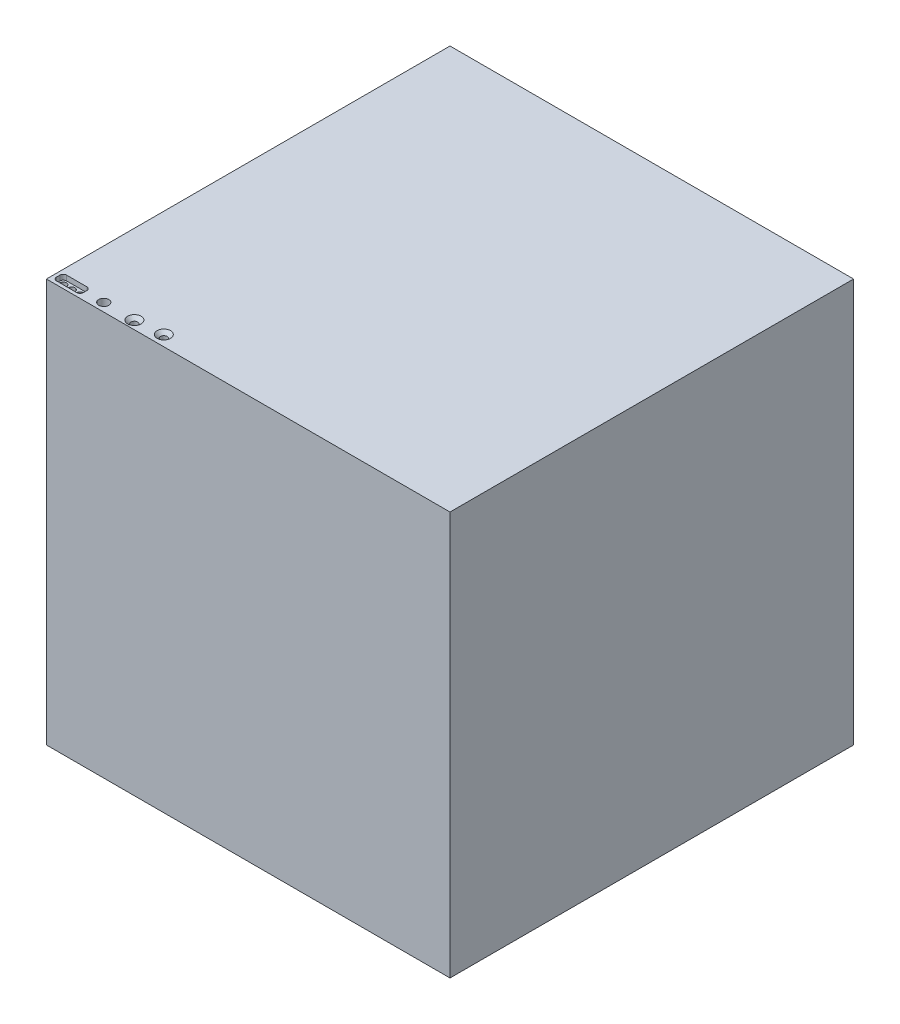
ISO-10303-21;
HEADER;
FILE_DESCRIPTION(('STEP AP214'),'2;1');
FILE_NAME('part.step','',(''),(''),'','','');
FILE_SCHEMA(('AUTOMOTIVE_DESIGN { 1 0 10303 214 1 1 1 1 }'));
ENDSEC;
DATA;
#1=APPLICATION_CONTEXT('core data for automotive mechanical design processes');
#2=APPLICATION_PROTOCOL_DEFINITION('international standard','automotive_design',2000,#1);
#3=PRODUCT_CONTEXT('',#1,'mechanical');
#4=PRODUCT('Part','Part','',(#3));
#5=PRODUCT_RELATED_PRODUCT_CATEGORY('part','',(#4));
#6=PRODUCT_DEFINITION_FORMATION('','',#4);
#7=PRODUCT_DEFINITION_CONTEXT('part definition',#1,'design');
#8=PRODUCT_DEFINITION('design','',#6,#7);
#9=PRODUCT_DEFINITION_SHAPE('','',#8);
#10=(LENGTH_UNIT() NAMED_UNIT(*) SI_UNIT(.MILLI.,.METRE.));
#11=(NAMED_UNIT(*) PLANE_ANGLE_UNIT() SI_UNIT($,.RADIAN.));
#12=(NAMED_UNIT(*) SI_UNIT($,.STERADIAN.) SOLID_ANGLE_UNIT());
#13=UNCERTAINTY_MEASURE_WITH_UNIT(LENGTH_MEASURE(1.E-05),#10,'distance_accuracy_value','');
#14=(GEOMETRIC_REPRESENTATION_CONTEXT(3) GLOBAL_UNCERTAINTY_ASSIGNED_CONTEXT((#13)) GLOBAL_UNIT_ASSIGNED_CONTEXT((#10,
#11,#12)) REPRESENTATION_CONTEXT('',''));
#15=CARTESIAN_POINT('',(0.,0.,0.));
#16=DIRECTION('',(0.,0.,1.));
#17=DIRECTION('',(1.,0.,0.));
#18=AXIS2_PLACEMENT_3D('',#15,#16,#17);
#19=CARTESIAN_POINT('',(0.,1200.,0.));
#20=DIRECTION('',(1.,0.,0.));
#21=DIRECTION('',(0.,0.,-1.));
#22=AXIS2_PLACEMENT_3D('',#19,#20,#21);
#23=PLANE('',#22);
#24=DIRECTION('',(0.,0.,1.));
#25=VECTOR('',#24,1.);
#26=CARTESIAN_POINT('',(0.,0.,0.));
#27=LINE('',#26,#25);
#28=CARTESIAN_POINT('',(0.,0.,-1200.));
#29=VERTEX_POINT('',#28);
#30=CARTESIAN_POINT('',(0.,0.,0.));
#31=VERTEX_POINT('',#30);
#32=EDGE_CURVE('E147',#29,#31,#27,.T.);
#33=ORIENTED_EDGE('',*,*,#32,.T.);
#34=DIRECTION('',(0.,-1.,0.));
#35=VECTOR('',#34,1.);
#36=CARTESIAN_POINT('',(0.,1200.,0.));
#37=LINE('',#36,#35);
#38=CARTESIAN_POINT('',(0.,1200.,0.));
#39=VERTEX_POINT('',#38);
#40=EDGE_CURVE('E128',#39,#31,#37,.T.);
#41=ORIENTED_EDGE('',*,*,#40,.F.);
#42=DIRECTION('',(0.,0.,1.));
#43=VECTOR('',#42,1.);
#44=CARTESIAN_POINT('',(0.,1200.,0.));
#45=LINE('',#44,#43);
#46=CARTESIAN_POINT('',(0.,1200.,-1200.));
#47=VERTEX_POINT('',#46);
#48=EDGE_CURVE('E135',#47,#39,#45,.T.);
#49=ORIENTED_EDGE('',*,*,#48,.F.);
#50=DIRECTION('',(0.,-1.,0.));
#51=VECTOR('',#50,1.);
#52=CARTESIAN_POINT('',(0.,1200.,-1200.));
#53=LINE('',#52,#51);
#54=EDGE_CURVE('E314',#47,#29,#53,.T.);
#55=ORIENTED_EDGE('',*,*,#54,.T.);
#56=EDGE_LOOP('',(#33,#41,#49,#55));
#57=FACE_BOUND('',#56,.T.);
#58=ADVANCED_FACE('F33',(#57),#23,.F.);
#59=CARTESIAN_POINT('',(0.,1200.,0.));
#60=DIRECTION('',(0.,0.,-1.));
#61=DIRECTION('',(-1.,0.,0.));
#62=AXIS2_PLACEMENT_3D('',#59,#60,#61);
#63=PLANE('',#62);
#64=DIRECTION('',(1.,0.,0.));
#65=VECTOR('',#64,1.);
#66=CARTESIAN_POINT('',(0.,0.,0.));
#67=LINE('',#66,#65);
#68=CARTESIAN_POINT('',(1200.,0.,0.));
#69=VERTEX_POINT('',#68);
#70=EDGE_CURVE('E316',#31,#69,#67,.T.);
#71=ORIENTED_EDGE('',*,*,#70,.T.);
#72=DIRECTION('',(0.,-1.,0.));
#73=VECTOR('',#72,1.);
#74=CARTESIAN_POINT('',(1200.,1200.,0.));
#75=LINE('',#74,#73);
#76=CARTESIAN_POINT('',(1200.,1200.,0.));
#77=VERTEX_POINT('',#76);
#78=EDGE_CURVE('E131',#77,#69,#75,.T.);
#79=ORIENTED_EDGE('',*,*,#78,.F.);
#80=DIRECTION('',(1.,0.,0.));
#81=VECTOR('',#80,1.);
#82=CARTESIAN_POINT('',(0.,1200.,0.));
#83=LINE('',#82,#81);
#84=EDGE_CURVE('E124',#39,#77,#83,.T.);
#85=ORIENTED_EDGE('',*,*,#84,.F.);
#86=ORIENTED_EDGE('',*,*,#40,.T.);
#87=EDGE_LOOP('',(#71,#79,#85,#86));
#88=FACE_BOUND('',#87,.T.);
#89=ADVANCED_FACE('F126',(#88),#63,.F.);
#90=CARTESIAN_POINT('',(1200.,1200.,0.));
#91=DIRECTION('',(-1.,0.,0.));
#92=DIRECTION('',(0.,0.,1.));
#93=AXIS2_PLACEMENT_3D('',#90,#91,#92);
#94=PLANE('',#93);
#95=DIRECTION('',(0.,0.,-1.));
#96=VECTOR('',#95,1.);
#97=CARTESIAN_POINT('',(1200.,0.,0.));
#98=LINE('',#97,#96);
#99=CARTESIAN_POINT('',(1200.,0.,-1200.));
#100=VERTEX_POINT('',#99);
#101=EDGE_CURVE('E318',#69,#100,#98,.T.);
#102=ORIENTED_EDGE('',*,*,#101,.T.);
#103=DIRECTION('',(0.,-1.,0.));
#104=VECTOR('',#103,1.);
#105=CARTESIAN_POINT('',(1200.,1200.,-1200.));
#106=LINE('',#105,#104);
#107=CARTESIAN_POINT('',(1200.,1200.,-1200.));
#108=VERTEX_POINT('',#107);
#109=EDGE_CURVE('E152',#108,#100,#106,.T.);
#110=ORIENTED_EDGE('',*,*,#109,.F.);
#111=DIRECTION('',(0.,0.,-1.));
#112=VECTOR('',#111,1.);
#113=CARTESIAN_POINT('',(1200.,1200.,0.));
#114=LINE('',#113,#112);
#115=EDGE_CURVE('E134',#77,#108,#114,.T.);
#116=ORIENTED_EDGE('',*,*,#115,.F.);
#117=ORIENTED_EDGE('',*,*,#78,.T.);
#118=EDGE_LOOP('',(#102,#110,#116,#117));
#119=FACE_BOUND('',#118,.T.);
#120=ADVANCED_FACE('F211',(#119),#94,.F.);
#121=CARTESIAN_POINT('',(0.,1200.,-1200.));
#122=DIRECTION('',(0.,0.,1.));
#123=DIRECTION('',(1.,0.,0.));
#124=AXIS2_PLACEMENT_3D('',#121,#122,#123);
#125=PLANE('',#124);
#126=DIRECTION('',(-1.,0.,0.));
#127=VECTOR('',#126,1.);
#128=CARTESIAN_POINT('',(0.,0.,-1200.));
#129=LINE('',#128,#127);
#130=EDGE_CURVE('E144',#100,#29,#129,.T.);
#131=ORIENTED_EDGE('',*,*,#130,.T.);
#132=ORIENTED_EDGE('',*,*,#54,.F.);
#133=DIRECTION('',(-1.,0.,0.));
#134=VECTOR('',#133,1.);
#135=CARTESIAN_POINT('',(0.,1200.,-1200.));
#136=LINE('',#135,#134);
#137=EDGE_CURVE('E140',#108,#47,#136,.T.);
#138=ORIENTED_EDGE('',*,*,#137,.F.);
#139=ORIENTED_EDGE('',*,*,#109,.T.);
#140=EDGE_LOOP('',(#131,#132,#138,#139));
#141=FACE_BOUND('',#140,.T.);
#142=ADVANCED_FACE('F325',(#141),#125,.F.);
#143=CARTESIAN_POINT('',(0.,1200.,0.));
#144=DIRECTION('',(0.,-1.,0.));
#145=DIRECTION('',(0.,0.,-1.));
#146=AXIS2_PLACEMENT_3D('',#143,#144,#145);
#147=PLANE('',#146);
#148=CARTESIAN_POINT('',(317.39806052974,1200.,-31.6120583291308));
#149=DIRECTION('',(0.,-1.,0.));
#150=DIRECTION('',(0.,0.,-1.));
#151=AXIS2_PLACEMENT_3D('',#148,#149,#150);
#152=CIRCLE('',#151,20.0000000000002);
#153=CARTESIAN_POINT('',(317.39806052974,1200.,-51.6120583291311));
#154=VERTEX_POINT('',#153);
#155=EDGE_CURVE('E11',#154,#154,#152,.T.);
#156=ORIENTED_EDGE('',*,*,#155,.T.);
#157=EDGE_LOOP('',(#156));
#158=FACE_BOUND('',#157,.T.);
#159=CARTESIAN_POINT('',(236.465344036915,1200.,-25.));
#160=DIRECTION('',(0.,-1.,0.));
#161=DIRECTION('',(0.,0.,-1.));
#162=AXIS2_PLACEMENT_3D('',#159,#160,#161);
#163=CIRCLE('',#162,20.);
#164=CARTESIAN_POINT('',(236.465344036915,1200.,-45.));
#165=VERTEX_POINT('',#164);
#166=EDGE_CURVE('E189',#165,#165,#163,.T.);
#167=ORIENTED_EDGE('',*,*,#166,.T.);
#168=EDGE_LOOP('',(#167));
#169=FACE_BOUND('',#168,.T.);
#170=CARTESIAN_POINT('',(145.500055776897,1200.,-25.));
#171=DIRECTION('',(0.,1.,0.));
#172=DIRECTION('',(0.,0.,1.));
#173=AXIS2_PLACEMENT_3D('',#170,#171,#172);
#174=CIRCLE('',#173,15.);
#175=CARTESIAN_POINT('',(145.500055776897,1200.,-9.99999999999998));
#176=VERTEX_POINT('',#175);
#177=EDGE_CURVE('E264',#176,#176,#174,.T.);
#178=ORIENTED_EDGE('',*,*,#177,.F.);
#179=EDGE_LOOP('',(#178));
#180=FACE_BOUND('',#179,.T.);
#181=DIRECTION('',(1.,0.,0.));
#182=VECTOR('',#181,1.);
#183=CARTESIAN_POINT('',(10.,1200.,-10.));
#184=LINE('',#183,#182);
#185=CARTESIAN_POINT('',(20.,1200.,-10.));
#186=VERTEX_POINT('',#185);
#187=CARTESIAN_POINT('',(80.,1200.,-10.));
#188=VERTEX_POINT('',#187);
#189=EDGE_CURVE('E304',#186,#188,#184,.T.);
#190=ORIENTED_EDGE('',*,*,#189,.F.);
#191=CARTESIAN_POINT('',(20.,1200.,-20.));
#192=DIRECTION('',(0.,-1.,0.));
#193=DIRECTION('',(0.,0.,-1.));
#194=AXIS2_PLACEMENT_3D('',#191,#192,#193);
#195=CIRCLE('',#194,10.);
#196=CARTESIAN_POINT('',(10.,1200.,-20.));
#197=VERTEX_POINT('',#196);
#198=EDGE_CURVE('E48',#186,#197,#195,.T.);
#199=ORIENTED_EDGE('',*,*,#198,.T.);
#200=DIRECTION('',(0.,0.,1.));
#201=VECTOR('',#200,1.);
#202=CARTESIAN_POINT('',(10.,1200.,-10.));
#203=LINE('',#202,#201);
#204=CARTESIAN_POINT('',(10.,1200.,-30.));
#205=VERTEX_POINT('',#204);
#206=EDGE_CURVE('E281',#205,#197,#203,.T.);
#207=ORIENTED_EDGE('',*,*,#206,.F.);
#208=CARTESIAN_POINT('',(20.,1200.,-30.));
#209=DIRECTION('',(0.,-1.,0.));
#210=DIRECTION('',(0.,0.,-1.));
#211=AXIS2_PLACEMENT_3D('',#208,#209,#210);
#212=CIRCLE('',#211,10.);
#213=CARTESIAN_POINT('',(20.,1200.,-40.));
#214=VERTEX_POINT('',#213);
#215=EDGE_CURVE('E56',#205,#214,#212,.T.);
#216=ORIENTED_EDGE('',*,*,#215,.T.);
#217=DIRECTION('',(-1.,0.,0.));
#218=VECTOR('',#217,1.);
#219=CARTESIAN_POINT('',(10.,1200.,-40.));
#220=LINE('',#219,#218);
#221=CARTESIAN_POINT('',(80.,1200.,-40.));
#222=VERTEX_POINT('',#221);
#223=EDGE_CURVE('E294',#222,#214,#220,.T.);
#224=ORIENTED_EDGE('',*,*,#223,.F.);
#225=CARTESIAN_POINT('',(80.,1200.,-30.));
#226=DIRECTION('',(0.,-1.,0.));
#227=DIRECTION('',(0.,0.,-1.));
#228=AXIS2_PLACEMENT_3D('',#225,#226,#227);
#229=CIRCLE('',#228,10.);
#230=CARTESIAN_POINT('',(90.,1200.,-30.));
#231=VERTEX_POINT('',#230);
#232=EDGE_CURVE('E182',#222,#231,#229,.T.);
#233=ORIENTED_EDGE('',*,*,#232,.T.);
#234=DIRECTION('',(0.,0.,-1.));
#235=VECTOR('',#234,1.);
#236=CARTESIAN_POINT('',(90.,1200.,-10.));
#237=LINE('',#236,#235);
#238=CARTESIAN_POINT('',(90.,1200.,-20.));
#239=VERTEX_POINT('',#238);
#240=EDGE_CURVE('E307',#239,#231,#237,.T.);
#241=ORIENTED_EDGE('',*,*,#240,.F.);
#242=CARTESIAN_POINT('',(80.,1200.,-20.));
#243=DIRECTION('',(0.,-1.,0.));
#244=DIRECTION('',(0.,0.,-1.));
#245=AXIS2_PLACEMENT_3D('',#242,#243,#244);
#246=CIRCLE('',#245,10.);
#247=EDGE_CURVE('E180',#239,#188,#246,.T.);
#248=ORIENTED_EDGE('',*,*,#247,.T.);
#249=EDGE_LOOP('',(#190,#199,#207,#216,#224,#233,#241,#248));
#250=FACE_BOUND('',#249,.T.);
#251=ORIENTED_EDGE('',*,*,#48,.T.);
#252=ORIENTED_EDGE('',*,*,#84,.T.);
#253=ORIENTED_EDGE('',*,*,#115,.T.);
#254=ORIENTED_EDGE('',*,*,#137,.T.);
#255=EDGE_LOOP('',(#251,#252,#253,#254));
#256=FACE_BOUND('',#255,.T.);
#257=ADVANCED_FACE('F138',(#158,#169,#180,#250,#256),#147,.F.);
#258=CARTESIAN_POINT('',(0.,0.,0.));
#259=DIRECTION('',(0.,-1.,0.));
#260=DIRECTION('',(0.,0.,-1.));
#261=AXIS2_PLACEMENT_3D('',#258,#259,#260);
#262=PLANE('',#261);
#263=CARTESIAN_POINT('',(50.,0.,-25.));
#264=DIRECTION('',(0.,1.,0.));
#265=DIRECTION('',(0.,0.,1.));
#266=AXIS2_PLACEMENT_3D('',#263,#264,#265);
#267=CIRCLE('',#266,10.);
#268=CARTESIAN_POINT('',(50.,0.,-15.));
#269=VERTEX_POINT('',#268);
#270=EDGE_CURVE('E272',#269,#269,#267,.T.);
#271=ORIENTED_EDGE('',*,*,#270,.T.);
#272=EDGE_LOOP('',(#271));
#273=FACE_BOUND('',#272,.T.);
#274=ORIENTED_EDGE('',*,*,#32,.F.);
#275=ORIENTED_EDGE('',*,*,#130,.F.);
#276=ORIENTED_EDGE('',*,*,#101,.F.);
#277=ORIENTED_EDGE('',*,*,#70,.F.);
#278=EDGE_LOOP('',(#274,#275,#276,#277));
#279=FACE_BOUND('',#278,.T.);
#280=ADVANCED_FACE('F329',(#273,#279),#262,.T.);
#281=CARTESIAN_POINT('',(10.,1185.,-10.));
#282=DIRECTION('',(-1.,0.,0.));
#283=DIRECTION('',(0.,0.,1.));
#284=AXIS2_PLACEMENT_3D('',#281,#282,#283);
#285=PLANE('',#284);
#286=DIRECTION('',(0.,0.,1.));
#287=VECTOR('',#286,1.);
#288=CARTESIAN_POINT('',(10.,1185.,-10.));
#289=LINE('',#288,#287);
#290=CARTESIAN_POINT('',(10.,1185.,-30.));
#291=VERTEX_POINT('',#290);
#292=CARTESIAN_POINT('',(10.,1185.,-20.));
#293=VERTEX_POINT('',#292);
#294=EDGE_CURVE('E290',#291,#293,#289,.T.);
#295=ORIENTED_EDGE('',*,*,#294,.F.);
#296=DIRECTION('',(0.,1.,0.));
#297=VECTOR('',#296,1.);
#298=CARTESIAN_POINT('',(10.,1200.,-30.));
#299=LINE('',#298,#297);
#300=EDGE_CURVE('E178',#291,#205,#299,.T.);
#301=ORIENTED_EDGE('',*,*,#300,.T.);
#302=ORIENTED_EDGE('',*,*,#206,.T.);
#303=DIRECTION('',(0.,1.,0.));
#304=VECTOR('',#303,1.);
#305=CARTESIAN_POINT('',(10.,1185.,-20.));
#306=LINE('',#305,#304);
#307=EDGE_CURVE('E176',#197,#293,#306,.F.);
#308=ORIENTED_EDGE('',*,*,#307,.T.);
#309=EDGE_LOOP('',(#295,#301,#302,#308));
#310=FACE_BOUND('',#309,.T.);
#311=ADVANCED_FACE('F338',(#310),#285,.F.);
#312=CARTESIAN_POINT('',(10.,1185.,-40.));
#313=DIRECTION('',(0.,0.,-1.));
#314=DIRECTION('',(-1.,0.,0.));
#315=AXIS2_PLACEMENT_3D('',#312,#313,#314);
#316=PLANE('',#315);
#317=DIRECTION('',(-1.,0.,0.));
#318=VECTOR('',#317,1.);
#319=CARTESIAN_POINT('',(10.,1185.,-40.));
#320=LINE('',#319,#318);
#321=CARTESIAN_POINT('',(80.,1185.,-40.));
#322=VERTEX_POINT('',#321);
#323=CARTESIAN_POINT('',(20.,1185.,-40.));
#324=VERTEX_POINT('',#323);
#325=EDGE_CURVE('E300',#322,#324,#320,.T.);
#326=ORIENTED_EDGE('',*,*,#325,.F.);
#327=DIRECTION('',(0.,1.,0.));
#328=VECTOR('',#327,1.);
#329=CARTESIAN_POINT('',(80.,1200.,-40.));
#330=LINE('',#329,#328);
#331=EDGE_CURVE('E173',#322,#222,#330,.T.);
#332=ORIENTED_EDGE('',*,*,#331,.T.);
#333=ORIENTED_EDGE('',*,*,#223,.T.);
#334=DIRECTION('',(0.,1.,0.));
#335=VECTOR('',#334,1.);
#336=CARTESIAN_POINT('',(20.,1185.,-40.));
#337=LINE('',#336,#335);
#338=EDGE_CURVE('E171',#214,#324,#337,.F.);
#339=ORIENTED_EDGE('',*,*,#338,.T.);
#340=EDGE_LOOP('',(#326,#332,#333,#339));
#341=FACE_BOUND('',#340,.T.);
#342=ADVANCED_FACE('F345',(#341),#316,.F.);
#343=CARTESIAN_POINT('',(90.,1185.,-10.));
#344=DIRECTION('',(1.,0.,0.));
#345=DIRECTION('',(0.,0.,-1.));
#346=AXIS2_PLACEMENT_3D('',#343,#344,#345);
#347=PLANE('',#346);
#348=DIRECTION('',(0.,0.,-1.));
#349=VECTOR('',#348,1.);
#350=CARTESIAN_POINT('',(90.,1185.,-10.));
#351=LINE('',#350,#349);
#352=CARTESIAN_POINT('',(90.,1185.,-20.));
#353=VERTEX_POINT('',#352);
#354=CARTESIAN_POINT('',(90.,1185.,-30.));
#355=VERTEX_POINT('',#354);
#356=EDGE_CURVE('E297',#353,#355,#351,.T.);
#357=ORIENTED_EDGE('',*,*,#356,.F.);
#358=DIRECTION('',(0.,1.,0.));
#359=VECTOR('',#358,1.);
#360=CARTESIAN_POINT('',(90.,1200.,-20.));
#361=LINE('',#360,#359);
#362=EDGE_CURVE('E150',#353,#239,#361,.T.);
#363=ORIENTED_EDGE('',*,*,#362,.T.);
#364=ORIENTED_EDGE('',*,*,#240,.T.);
#365=DIRECTION('',(0.,1.,0.));
#366=VECTOR('',#365,1.);
#367=CARTESIAN_POINT('',(90.,1185.,-30.));
#368=LINE('',#367,#366);
#369=EDGE_CURVE('E148',#231,#355,#368,.F.);
#370=ORIENTED_EDGE('',*,*,#369,.T.);
#371=EDGE_LOOP('',(#357,#363,#364,#370));
#372=FACE_BOUND('',#371,.T.);
#373=ADVANCED_FACE('F350',(#372),#347,.F.);
#374=CARTESIAN_POINT('',(10.,1185.,-10.));
#375=DIRECTION('',(0.,0.,1.));
#376=DIRECTION('',(1.,0.,0.));
#377=AXIS2_PLACEMENT_3D('',#374,#375,#376);
#378=PLANE('',#377);
#379=ORIENTED_EDGE('',*,*,#189,.T.);
#380=DIRECTION('',(0.,1.,0.));
#381=VECTOR('',#380,1.);
#382=CARTESIAN_POINT('',(80.,1185.,-10.));
#383=LINE('',#382,#381);
#384=CARTESIAN_POINT('',(80.,1185.,-10.));
#385=VERTEX_POINT('',#384);
#386=EDGE_CURVE('E161',#188,#385,#383,.F.);
#387=ORIENTED_EDGE('',*,*,#386,.T.);
#388=DIRECTION('',(1.,0.,0.));
#389=VECTOR('',#388,1.);
#390=CARTESIAN_POINT('',(10.,1185.,-10.));
#391=LINE('',#390,#389);
#392=CARTESIAN_POINT('',(20.,1185.,-10.));
#393=VERTEX_POINT('',#392);
#394=EDGE_CURVE('E293',#393,#385,#391,.T.);
#395=ORIENTED_EDGE('',*,*,#394,.F.);
#396=DIRECTION('',(0.,1.,0.));
#397=VECTOR('',#396,1.);
#398=CARTESIAN_POINT('',(20.,1200.,-10.));
#399=LINE('',#398,#397);
#400=EDGE_CURVE('E158',#393,#186,#399,.T.);
#401=ORIENTED_EDGE('',*,*,#400,.T.);
#402=EDGE_LOOP('',(#379,#387,#395,#401));
#403=FACE_BOUND('',#402,.T.);
#404=ADVANCED_FACE('F347',(#403),#378,.F.);
#405=CARTESIAN_POINT('',(0.,1185.,0.));
#406=DIRECTION('',(0.,-1.,0.));
#407=DIRECTION('',(0.,0.,-1.));
#408=AXIS2_PLACEMENT_3D('',#405,#406,#407);
#409=PLANE('',#408);
#410=CARTESIAN_POINT('',(50.,1185.,-25.));
#411=DIRECTION('',(0.,1.,0.));
#412=DIRECTION('',(0.,0.,1.));
#413=AXIS2_PLACEMENT_3D('',#410,#411,#412);
#414=CIRCLE('',#413,10.);
#415=CARTESIAN_POINT('',(50.,1185.,-15.));
#416=VERTEX_POINT('',#415);
#417=EDGE_CURVE('E269',#416,#416,#414,.T.);
#418=ORIENTED_EDGE('',*,*,#417,.F.);
#419=EDGE_LOOP('',(#418));
#420=FACE_BOUND('',#419,.T.);
#421=CARTESIAN_POINT('',(25.,1185.,-25.));
#422=DIRECTION('',(0.,1.,0.));
#423=DIRECTION('',(0.,0.,1.));
#424=AXIS2_PLACEMENT_3D('',#421,#422,#423);
#425=CIRCLE('',#424,10.);
#426=CARTESIAN_POINT('',(25.,1185.,-15.));
#427=VERTEX_POINT('',#426);
#428=EDGE_CURVE('E282',#427,#427,#425,.T.);
#429=ORIENTED_EDGE('',*,*,#428,.F.);
#430=EDGE_LOOP('',(#429));
#431=FACE_BOUND('',#430,.T.);
#432=CARTESIAN_POINT('',(75.,1185.,-25.));
#433=DIRECTION('',(0.,1.,0.));
#434=DIRECTION('',(0.,0.,1.));
#435=AXIS2_PLACEMENT_3D('',#432,#433,#434);
#436=CIRCLE('',#435,9.99999999999999);
#437=CARTESIAN_POINT('',(75.,1185.,-15.));
#438=VERTEX_POINT('',#437);
#439=EDGE_CURVE('E275',#438,#438,#436,.T.);
#440=ORIENTED_EDGE('',*,*,#439,.F.);
#441=EDGE_LOOP('',(#440));
#442=FACE_BOUND('',#441,.T.);
#443=ORIENTED_EDGE('',*,*,#394,.T.);
#444=CARTESIAN_POINT('',(80.,1185.,-20.));
#445=DIRECTION('',(0.,-1.,0.));
#446=DIRECTION('',(0.,0.,-1.));
#447=AXIS2_PLACEMENT_3D('',#444,#445,#446);
#448=CIRCLE('',#447,10.);
#449=EDGE_CURVE('E169',#385,#353,#448,.F.);
#450=ORIENTED_EDGE('',*,*,#449,.T.);
#451=ORIENTED_EDGE('',*,*,#356,.T.);
#452=CARTESIAN_POINT('',(80.,1185.,-30.));
#453=DIRECTION('',(0.,-1.,0.));
#454=DIRECTION('',(0.,0.,-1.));
#455=AXIS2_PLACEMENT_3D('',#452,#453,#454);
#456=CIRCLE('',#455,10.);
#457=EDGE_CURVE('E167',#355,#322,#456,.F.);
#458=ORIENTED_EDGE('',*,*,#457,.T.);
#459=ORIENTED_EDGE('',*,*,#325,.T.);
#460=CARTESIAN_POINT('',(20.,1185.,-30.));
#461=DIRECTION('',(0.,-1.,0.));
#462=DIRECTION('',(0.,0.,-1.));
#463=AXIS2_PLACEMENT_3D('',#460,#461,#462);
#464=CIRCLE('',#463,10.);
#465=EDGE_CURVE('E165',#324,#291,#464,.F.);
#466=ORIENTED_EDGE('',*,*,#465,.T.);
#467=ORIENTED_EDGE('',*,*,#294,.T.);
#468=CARTESIAN_POINT('',(20.,1185.,-20.));
#469=DIRECTION('',(0.,-1.,0.));
#470=DIRECTION('',(0.,0.,-1.));
#471=AXIS2_PLACEMENT_3D('',#468,#469,#470);
#472=CIRCLE('',#471,10.);
#473=EDGE_CURVE('E163',#293,#393,#472,.F.);
#474=ORIENTED_EDGE('',*,*,#473,.T.);
#475=EDGE_LOOP('',(#443,#450,#451,#458,#459,#466,#467,#474));
#476=FACE_BOUND('',#475,.T.);
#477=ADVANCED_FACE('F219',(#420,#431,#442,#476),#409,.F.);
#478=CARTESIAN_POINT('',(80.,1185.,-20.));
#479=DIRECTION('',(0.,-1.,0.));
#480=DIRECTION('',(0.,0.,-1.));
#481=AXIS2_PLACEMENT_3D('',#478,#479,#480);
#482=CYLINDRICAL_SURFACE('',#481,10.);
#483=ORIENTED_EDGE('',*,*,#449,.F.);
#484=ORIENTED_EDGE('',*,*,#386,.F.);
#485=ORIENTED_EDGE('',*,*,#247,.F.);
#486=ORIENTED_EDGE('',*,*,#362,.F.);
#487=EDGE_LOOP('',(#483,#484,#485,#486));
#488=FACE_BOUND('',#487,.T.);
#489=ADVANCED_FACE('F215',(#488),#482,.F.);
#490=CARTESIAN_POINT('',(80.,1185.,-30.));
#491=DIRECTION('',(0.,-1.,0.));
#492=DIRECTION('',(0.,0.,-1.));
#493=AXIS2_PLACEMENT_3D('',#490,#491,#492);
#494=CYLINDRICAL_SURFACE('',#493,10.);
#495=ORIENTED_EDGE('',*,*,#457,.F.);
#496=ORIENTED_EDGE('',*,*,#369,.F.);
#497=ORIENTED_EDGE('',*,*,#232,.F.);
#498=ORIENTED_EDGE('',*,*,#331,.F.);
#499=EDGE_LOOP('',(#495,#496,#497,#498));
#500=FACE_BOUND('',#499,.T.);
#501=ADVANCED_FACE('F218',(#500),#494,.F.);
#502=CARTESIAN_POINT('',(20.,1185.,-30.));
#503=DIRECTION('',(0.,-1.,0.));
#504=DIRECTION('',(0.,0.,-1.));
#505=AXIS2_PLACEMENT_3D('',#502,#503,#504);
#506=CYLINDRICAL_SURFACE('',#505,10.);
#507=ORIENTED_EDGE('',*,*,#465,.F.);
#508=ORIENTED_EDGE('',*,*,#338,.F.);
#509=ORIENTED_EDGE('',*,*,#215,.F.);
#510=ORIENTED_EDGE('',*,*,#300,.F.);
#511=EDGE_LOOP('',(#507,#508,#509,#510));
#512=FACE_BOUND('',#511,.T.);
#513=ADVANCED_FACE('F223',(#512),#506,.F.);
#514=CARTESIAN_POINT('',(20.,1185.,-20.));
#515=DIRECTION('',(0.,-1.,0.));
#516=DIRECTION('',(0.,0.,-1.));
#517=AXIS2_PLACEMENT_3D('',#514,#515,#516);
#518=CYLINDRICAL_SURFACE('',#517,10.);
#519=ORIENTED_EDGE('',*,*,#473,.F.);
#520=ORIENTED_EDGE('',*,*,#307,.F.);
#521=ORIENTED_EDGE('',*,*,#198,.F.);
#522=ORIENTED_EDGE('',*,*,#400,.F.);
#523=EDGE_LOOP('',(#519,#520,#521,#522));
#524=FACE_BOUND('',#523,.T.);
#525=ADVANCED_FACE('F227',(#524),#518,.F.);
#526=CARTESIAN_POINT('',(75.,1170.,-25.));
#527=DIRECTION('',(0.,1.,0.));
#528=DIRECTION('',(0.,0.,1.));
#529=AXIS2_PLACEMENT_3D('',#526,#527,#528);
#530=CYLINDRICAL_SURFACE('',#529,9.99999999999999);
#531=CARTESIAN_POINT('',(75.,1170.,-25.));
#532=DIRECTION('',(0.,1.,0.));
#533=DIRECTION('',(0.,0.,1.));
#534=AXIS2_PLACEMENT_3D('',#531,#532,#533);
#535=CIRCLE('',#534,9.99999999999999);
#536=CARTESIAN_POINT('',(75.,1170.,-15.));
#537=VERTEX_POINT('',#536);
#538=EDGE_CURVE('E285',#537,#537,#535,.T.);
#539=ORIENTED_EDGE('',*,*,#538,.F.);
#540=EDGE_LOOP('',(#539));
#541=FACE_BOUND('',#540,.T.);
#542=ORIENTED_EDGE('',*,*,#439,.T.);
#543=EDGE_LOOP('',(#542));
#544=FACE_BOUND('',#543,.T.);
#545=ADVANCED_FACE('F229',(#541,#544),#530,.F.);
#546=CARTESIAN_POINT('',(75.,1170.,-25.));
#547=DIRECTION('',(0.,1.,0.));
#548=DIRECTION('',(0.,0.,1.));
#549=AXIS2_PLACEMENT_3D('',#546,#547,#548);
#550=PLANE('',#549);
#551=ORIENTED_EDGE('',*,*,#538,.T.);
#552=EDGE_LOOP('',(#551));
#553=FACE_BOUND('',#552,.T.);
#554=ADVANCED_FACE('F363',(#553),#550,.T.);
#555=CARTESIAN_POINT('',(25.,1170.,-25.));
#556=DIRECTION('',(0.,1.,0.));
#557=DIRECTION('',(0.,0.,1.));
#558=AXIS2_PLACEMENT_3D('',#555,#556,#557);
#559=CYLINDRICAL_SURFACE('',#558,10.);
#560=CARTESIAN_POINT('',(25.,1170.,-25.));
#561=DIRECTION('',(0.,1.,0.));
#562=DIRECTION('',(0.,0.,1.));
#563=AXIS2_PLACEMENT_3D('',#560,#561,#562);
#564=CIRCLE('',#563,10.);
#565=CARTESIAN_POINT('',(25.,1170.,-15.));
#566=VERTEX_POINT('',#565);
#567=EDGE_CURVE('E278',#566,#566,#564,.T.);
#568=ORIENTED_EDGE('',*,*,#567,.F.);
#569=EDGE_LOOP('',(#568));
#570=FACE_BOUND('',#569,.T.);
#571=ORIENTED_EDGE('',*,*,#428,.T.);
#572=EDGE_LOOP('',(#571));
#573=FACE_BOUND('',#572,.T.);
#574=ADVANCED_FACE('F367',(#570,#573),#559,.F.);
#575=CARTESIAN_POINT('',(25.,1170.,-25.));
#576=DIRECTION('',(0.,1.,0.));
#577=DIRECTION('',(0.,0.,1.));
#578=AXIS2_PLACEMENT_3D('',#575,#576,#577);
#579=PLANE('',#578);
#580=ORIENTED_EDGE('',*,*,#567,.T.);
#581=EDGE_LOOP('',(#580));
#582=FACE_BOUND('',#581,.T.);
#583=ADVANCED_FACE('F371',(#582),#579,.T.);
#584=CARTESIAN_POINT('',(50.,0.,-25.));
#585=DIRECTION('',(0.,1.,0.));
#586=DIRECTION('',(0.,0.,1.));
#587=AXIS2_PLACEMENT_3D('',#584,#585,#586);
#588=CYLINDRICAL_SURFACE('',#587,10.);
#589=CARTESIAN_POINT('',(50.,0.,-15.));
#590=CARTESIAN_POINT('',(50.,12.34375,-15.));
#591=CARTESIAN_POINT('',(50.,24.6875,-15.));
#592=CARTESIAN_POINT('',(50.,49.375,-15.));
#593=CARTESIAN_POINT('',(50.,61.71875,-15.));
#594=CARTESIAN_POINT('',(50.,86.40625,-15.));
#595=CARTESIAN_POINT('',(50.,98.75,-15.));
#596=CARTESIAN_POINT('',(50.,123.4375,-15.));
#597=CARTESIAN_POINT('',(50.,135.78125,-15.));
#598=CARTESIAN_POINT('',(50.,160.46875,-15.));
#599=CARTESIAN_POINT('',(50.,172.8125,-15.));
#600=CARTESIAN_POINT('',(50.,197.5,-15.));
#601=CARTESIAN_POINT('',(50.,209.84375,-15.));
#602=CARTESIAN_POINT('',(50.,234.53125,-15.));
#603=CARTESIAN_POINT('',(50.,246.875,-15.));
#604=CARTESIAN_POINT('',(50.,271.5625,-15.));
#605=CARTESIAN_POINT('',(50.,283.90625,-15.));
#606=CARTESIAN_POINT('',(50.,308.59375,-15.));
#607=CARTESIAN_POINT('',(50.,320.9375,-15.));
#608=CARTESIAN_POINT('',(50.,345.625,-15.));
#609=CARTESIAN_POINT('',(50.,357.96875,-15.));
#610=CARTESIAN_POINT('',(50.,382.65625,-15.));
#611=CARTESIAN_POINT('',(50.,395.,-15.));
#612=CARTESIAN_POINT('',(50.,419.6875,-15.));
#613=CARTESIAN_POINT('',(50.,432.03125,-15.));
#614=CARTESIAN_POINT('',(50.,456.71875,-15.));
#615=CARTESIAN_POINT('',(50.,469.0625,-15.));
#616=CARTESIAN_POINT('',(50.,493.75,-15.));
#617=CARTESIAN_POINT('',(50.,506.09375,-15.));
#618=CARTESIAN_POINT('',(50.,530.78125,-15.));
#619=CARTESIAN_POINT('',(50.,543.125,-15.));
#620=CARTESIAN_POINT('',(50.,567.8125,-15.));
#621=CARTESIAN_POINT('',(50.,580.15625,-15.));
#622=CARTESIAN_POINT('',(50.,604.84375,-15.));
#623=CARTESIAN_POINT('',(50.,617.1875,-15.));
#624=CARTESIAN_POINT('',(50.,641.875,-15.));
#625=CARTESIAN_POINT('',(50.,654.21875,-15.));
#626=CARTESIAN_POINT('',(50.,678.90625,-15.));
#627=CARTESIAN_POINT('',(50.,691.25,-15.));
#628=CARTESIAN_POINT('',(50.,715.9375,-15.));
#629=CARTESIAN_POINT('',(50.,728.28125,-15.));
#630=CARTESIAN_POINT('',(50.,752.96875,-15.));
#631=CARTESIAN_POINT('',(50.,765.3125,-15.));
#632=CARTESIAN_POINT('',(50.,790.,-15.));
#633=CARTESIAN_POINT('',(50.,802.34375,-15.));
#634=CARTESIAN_POINT('',(50.,827.03125,-15.));
#635=CARTESIAN_POINT('',(50.,839.375,-15.));
#636=CARTESIAN_POINT('',(50.,864.0625,-15.));
#637=CARTESIAN_POINT('',(50.,876.40625,-15.));
#638=CARTESIAN_POINT('',(50.,901.09375,-15.));
#639=CARTESIAN_POINT('',(50.,913.4375,-15.));
#640=CARTESIAN_POINT('',(50.,938.125,-15.));
#641=CARTESIAN_POINT('',(50.,950.46875,-15.));
#642=CARTESIAN_POINT('',(50.,975.15625,-15.));
#643=CARTESIAN_POINT('',(50.,987.5,-15.));
#644=CARTESIAN_POINT('',(50.,1012.1875,-15.));
#645=CARTESIAN_POINT('',(50.,1024.53125,-15.));
#646=CARTESIAN_POINT('',(50.,1049.21875,-15.));
#647=CARTESIAN_POINT('',(50.,1061.5625,-15.));
#648=CARTESIAN_POINT('',(50.,1086.25,-15.));
#649=CARTESIAN_POINT('',(50.,1098.59375,-15.));
#650=CARTESIAN_POINT('',(50.,1123.28125,-15.));
#651=CARTESIAN_POINT('',(50.,1135.625,-15.));
#652=CARTESIAN_POINT('',(50.,1160.3125,-15.));
#653=CARTESIAN_POINT('',(50.,1172.65625,-15.));
#654=CARTESIAN_POINT('',(50.,1185.,-15.));
#655=B_SPLINE_CURVE_WITH_KNOTS('',3,(#589,#590,#591,#592,#593,#594,#595,#596,#597,#598,#599,
#600,#601,#602,#603,#604,#605,#606,#607,#608,#609,#610,#611,#612,#613,#614,#615,#616,#617,#618,
#619,#620,#621,#622,#623,#624,#625,#626,#627,#628,#629,#630,#631,#632,#633,#634,#635,#636,#637,
#638,#639,#640,#641,#642,#643,#644,#645,#646,#647,#648,#649,#650,#651,#652,#653,#654),
.UNSPECIFIED.,.F.,.F.,(4,2,2,2,2,2,2,2,2,2,2,2,2,2,2,2,2,2,2,2,2,2,2,2,2,2,2,2,2,2,2,2,4),(0.,
37.03125,74.0625,111.09375,148.125,185.15625,222.1875,259.21875,296.25,333.28125,370.3125,
407.34375,444.375,481.40625,518.4375,555.46875,592.5,629.53125,666.5625,703.59375,740.625,
777.65625,814.6875,851.71875,888.75,925.78125,962.8125,999.84375,1036.875,1073.90625,1110.9375,
1147.96875,1185.),.UNSPECIFIED.);
#656=EDGE_CURVE('BSEAM375',#269,#416,#655,.T.);
#657=ORIENTED_EDGE('',*,*,#270,.F.);
#658=ORIENTED_EDGE('',*,*,#417,.T.);
#659=ORIENTED_EDGE('',*,*,#656,.T.);
#660=ORIENTED_EDGE('',*,*,#656,.F.);
#661=EDGE_LOOP('',(#657,#659,#658,#660));
#662=FACE_BOUND('',#661,.T.);
#663=ADVANCED_FACE('F375',(#662),#588,.F.);
#664=CARTESIAN_POINT('',(145.500055776897,1100.,-25.));
#665=DIRECTION('',(0.,1.,0.));
#666=DIRECTION('',(0.,0.,1.));
#667=AXIS2_PLACEMENT_3D('',#664,#665,#666);
#668=CYLINDRICAL_SURFACE('',#667,15.);
#669=CARTESIAN_POINT('',(145.500055776897,1100.,-25.));
#670=DIRECTION('',(0.,1.,0.));
#671=DIRECTION('',(0.,0.,1.));
#672=AXIS2_PLACEMENT_3D('',#669,#670,#671);
#673=CIRCLE('',#672,15.);
#674=CARTESIAN_POINT('',(145.500055776897,1100.,-9.99999999999998));
#675=VERTEX_POINT('',#674);
#676=EDGE_CURVE('E266',#675,#675,#673,.T.);
#677=ORIENTED_EDGE('',*,*,#676,.F.);
#678=EDGE_LOOP('',(#677));
#679=FACE_BOUND('',#678,.T.);
#680=ORIENTED_EDGE('',*,*,#177,.T.);
#681=EDGE_LOOP('',(#680));
#682=FACE_BOUND('',#681,.T.);
#683=ADVANCED_FACE('F379',(#679,#682),#668,.F.);
#684=CARTESIAN_POINT('',(145.500055776897,1100.,-25.));
#685=DIRECTION('',(0.,1.,0.));
#686=DIRECTION('',(0.,0.,1.));
#687=AXIS2_PLACEMENT_3D('',#684,#685,#686);
#688=PLANE('',#687);
#689=CARTESIAN_POINT('',(145.500055776897,1100.,-25.));
#690=DIRECTION('',(0.,1.,0.));
#691=DIRECTION('',(0.,0.,1.));
#692=AXIS2_PLACEMENT_3D('',#689,#690,#691);
#693=CIRCLE('',#692,7.50000000000001);
#694=CARTESIAN_POINT('',(145.500055776897,1100.,-17.5));
#695=VERTEX_POINT('',#694);
#696=EDGE_CURVE('E254',#695,#695,#693,.T.);
#697=ORIENTED_EDGE('',*,*,#696,.F.);
#698=EDGE_LOOP('',(#697));
#699=FACE_BOUND('',#698,.T.);
#700=ORIENTED_EDGE('',*,*,#676,.T.);
#701=EDGE_LOOP('',(#700));
#702=FACE_BOUND('',#701,.T.);
#703=ADVANCED_FACE('F383',(#699,#702),#688,.T.);
#704=CARTESIAN_POINT('',(145.500055776897,1000.,-25.));
#705=DIRECTION('',(0.,1.,0.));
#706=DIRECTION('',(0.,0.,1.));
#707=AXIS2_PLACEMENT_3D('',#704,#705,#706);
#708=CYLINDRICAL_SURFACE('',#707,7.50000000000001);
#709=CARTESIAN_POINT('',(145.500055776897,1000.,-25.));
#710=DIRECTION('',(0.,1.,0.));
#711=DIRECTION('',(0.,0.,1.));
#712=AXIS2_PLACEMENT_3D('',#709,#710,#711);
#713=CIRCLE('',#712,7.50000000000001);
#714=CARTESIAN_POINT('',(145.500055776897,1000.,-17.5));
#715=VERTEX_POINT('',#714);
#716=EDGE_CURVE('E258',#715,#715,#713,.T.);
#717=ORIENTED_EDGE('',*,*,#716,.F.);
#718=EDGE_LOOP('',(#717));
#719=FACE_BOUND('',#718,.T.);
#720=ORIENTED_EDGE('',*,*,#696,.T.);
#721=EDGE_LOOP('',(#720));
#722=FACE_BOUND('',#721,.T.);
#723=ADVANCED_FACE('F387',(#719,#722),#708,.F.);
#724=CARTESIAN_POINT('',(145.500055776897,1000.,-25.));
#725=DIRECTION('',(0.,1.,0.));
#726=DIRECTION('',(0.,0.,1.));
#727=AXIS2_PLACEMENT_3D('',#724,#725,#726);
#728=PLANE('',#727);
#729=ORIENTED_EDGE('',*,*,#716,.T.);
#730=EDGE_LOOP('',(#729));
#731=FACE_BOUND('',#730,.T.);
#732=ADVANCED_FACE('F249',(#731),#728,.T.);
#733=CARTESIAN_POINT('',(236.465344036915,950.,-25.));
#734=DIRECTION('',(0.,1.,0.));
#735=DIRECTION('',(0.,0.,1.));
#736=AXIS2_PLACEMENT_3D('',#733,#734,#735);
#737=CYLINDRICAL_SURFACE('',#736,10.);
#738=CARTESIAN_POINT('',(236.465344036915,1190.,-25.));
#739=DIRECTION('',(0.,-1.,0.));
#740=DIRECTION('',(0.,0.,-1.));
#741=AXIS2_PLACEMENT_3D('',#738,#739,#740);
#742=CIRCLE('',#741,10.);
#743=CARTESIAN_POINT('',(236.465344036915,1190.,-35.));
#744=VERTEX_POINT('',#743);
#745=EDGE_CURVE('E186',#744,#744,#742,.F.);
#746=ORIENTED_EDGE('',*,*,#745,.T.);
#747=EDGE_LOOP('',(#746));
#748=FACE_BOUND('',#747,.T.);
#749=CARTESIAN_POINT('',(236.465344036915,950.,-25.));
#750=DIRECTION('',(0.,1.,0.));
#751=DIRECTION('',(0.,0.,1.));
#752=AXIS2_PLACEMENT_3D('',#749,#750,#751);
#753=CIRCLE('',#752,10.);
#754=CARTESIAN_POINT('',(236.465344036915,950.,-15.));
#755=VERTEX_POINT('',#754);
#756=EDGE_CURVE('E253',#755,#755,#753,.T.);
#757=ORIENTED_EDGE('',*,*,#756,.F.);
#758=EDGE_LOOP('',(#757));
#759=FACE_BOUND('',#758,.T.);
#760=ADVANCED_FACE('F240',(#748,#759),#737,.F.);
#761=CARTESIAN_POINT('',(236.465344036915,950.,-25.));
#762=DIRECTION('',(0.,1.,0.));
#763=DIRECTION('',(0.,0.,1.));
#764=AXIS2_PLACEMENT_3D('',#761,#762,#763);
#765=PLANE('',#764);
#766=ORIENTED_EDGE('',*,*,#756,.T.);
#767=EDGE_LOOP('',(#766));
#768=FACE_BOUND('',#767,.T.);
#769=ADVANCED_FACE('F233',(#768),#765,.T.);
#770=CARTESIAN_POINT('',(236.465344036915,1190.,-25.));
#771=DIRECTION('',(0.,1.,0.));
#772=DIRECTION('',(0.,0.,1.));
#773=AXIS2_PLACEMENT_3D('',#770,#771,#772);
#774=CONICAL_SURFACE('',#773,10.,0.785398163397437);
#775=ORIENTED_EDGE('',*,*,#166,.F.);
#776=EDGE_LOOP('',(#775));
#777=FACE_BOUND('',#776,.T.);
#778=ORIENTED_EDGE('',*,*,#745,.F.);
#779=EDGE_LOOP('',(#778));
#780=FACE_BOUND('',#779,.T.);
#781=ADVANCED_FACE('F231',(#777,#780),#774,.F.);
#782=CARTESIAN_POINT('',(317.39806052974,1169.996,-31.6120583291308));
#783=DIRECTION('',(0.,1.,0.));
#784=DIRECTION('',(0.,0.,1.));
#785=AXIS2_PLACEMENT_3D('',#782,#783,#784);
#786=CYLINDRICAL_SURFACE('',#785,9.99999999999998);
#787=CARTESIAN_POINT('',(317.39806052974,1190.,-31.6120583291308));
#788=DIRECTION('',(0.,-1.,0.));
#789=DIRECTION('',(0.,0.,-1.));
#790=AXIS2_PLACEMENT_3D('',#787,#788,#789);
#791=CIRCLE('',#790,9.99999999999998);
#792=CARTESIAN_POINT('',(317.39806052974,1190.,-41.6120583291308));
#793=VERTEX_POINT('',#792);
#794=EDGE_CURVE('E41',#793,#793,#791,.F.);
#795=ORIENTED_EDGE('',*,*,#794,.T.);
#796=EDGE_LOOP('',(#795));
#797=FACE_BOUND('',#796,.T.);
#798=CARTESIAN_POINT('',(317.39806052974,1169.996,-31.6120583291308));
#799=DIRECTION('',(0.,1.,0.));
#800=DIRECTION('',(0.,0.,1.));
#801=AXIS2_PLACEMENT_3D('',#798,#799,#800);
#802=CIRCLE('',#801,9.99999999999998);
#803=CARTESIAN_POINT('',(317.39806052974,1169.996,-21.6120583291308));
#804=VERTEX_POINT('',#803);
#805=EDGE_CURVE('E255',#804,#804,#802,.T.);
#806=ORIENTED_EDGE('',*,*,#805,.F.);
#807=EDGE_LOOP('',(#806));
#808=FACE_BOUND('',#807,.T.);
#809=ADVANCED_FACE('F194',(#797,#808),#786,.F.);
#810=CARTESIAN_POINT('',(317.39806052974,1169.996,-31.6120583291308));
#811=DIRECTION('',(0.,1.,0.));
#812=DIRECTION('',(0.,0.,1.));
#813=AXIS2_PLACEMENT_3D('',#810,#811,#812);
#814=PLANE('',#813);
#815=ORIENTED_EDGE('',*,*,#805,.T.);
#816=EDGE_LOOP('',(#815));
#817=FACE_BOUND('',#816,.T.);
#818=ADVANCED_FACE('F198',(#817),#814,.T.);
#819=CARTESIAN_POINT('',(317.39806052974,1190.,-31.6120583291308));
#820=DIRECTION('',(0.,1.,0.));
#821=DIRECTION('',(0.,0.,1.));
#822=AXIS2_PLACEMENT_3D('',#819,#820,#821);
#823=CONICAL_SURFACE('',#822,9.99999999999998,0.785398163397439);
#824=ORIENTED_EDGE('',*,*,#155,.F.);
#825=EDGE_LOOP('',(#824));
#826=FACE_BOUND('',#825,.T.);
#827=ORIENTED_EDGE('',*,*,#794,.F.);
#828=EDGE_LOOP('',(#827));
#829=FACE_BOUND('',#828,.T.);
#830=ADVANCED_FACE('F35',(#826,#829),#823,.F.);
#831=CLOSED_SHELL('',(#58,#89,#120,#142,#257,#280,#311,#342,#373,#404,#477,#489,#501,#513,#525,
#545,#554,#574,#583,#663,#683,#703,#723,#732,#760,#769,#781,#809,#818,#830));
#832=MANIFOLD_SOLID_BREP('B2',#831);
#833=ADVANCED_BREP_SHAPE_REPRESENTATION('',(#18,#832),#14);
#834=SHAPE_DEFINITION_REPRESENTATION(#9,#833);
ENDSEC;
END-ISO-10303-21;
